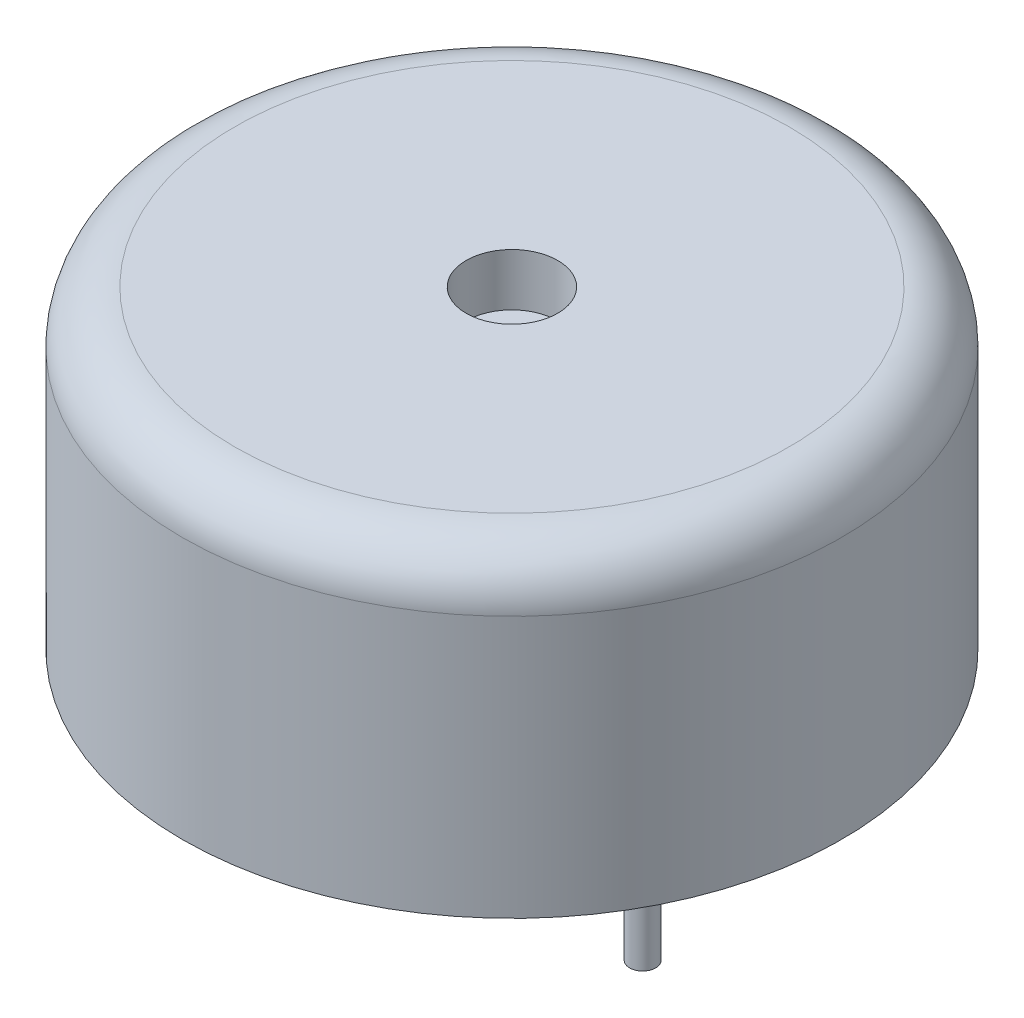
ISO-10303-21;
HEADER;
FILE_DESCRIPTION(('STEP AP214'),'2;1');
FILE_NAME('part.step','',(''),(''),'','','');
FILE_SCHEMA(('AUTOMOTIVE_DESIGN { 1 0 10303 214 1 1 1 1 }'));
ENDSEC;
DATA;
#1=APPLICATION_CONTEXT('core data for automotive mechanical design processes');
#2=APPLICATION_PROTOCOL_DEFINITION('international standard','automotive_design',2000,#1);
#3=PRODUCT_CONTEXT('',#1,'mechanical');
#4=PRODUCT('Part','Part','',(#3));
#5=PRODUCT_RELATED_PRODUCT_CATEGORY('part','',(#4));
#6=PRODUCT_DEFINITION_FORMATION('','',#4);
#7=PRODUCT_DEFINITION_CONTEXT('part definition',#1,'design');
#8=PRODUCT_DEFINITION('design','',#6,#7);
#9=PRODUCT_DEFINITION_SHAPE('','',#8);
#10=(LENGTH_UNIT() NAMED_UNIT(*) SI_UNIT(.MILLI.,.METRE.));
#11=(NAMED_UNIT(*) PLANE_ANGLE_UNIT() SI_UNIT($,.RADIAN.));
#12=(NAMED_UNIT(*) SI_UNIT($,.STERADIAN.) SOLID_ANGLE_UNIT());
#13=UNCERTAINTY_MEASURE_WITH_UNIT(LENGTH_MEASURE(1.E-05),#10,'distance_accuracy_value','');
#14=(GEOMETRIC_REPRESENTATION_CONTEXT(3) GLOBAL_UNCERTAINTY_ASSIGNED_CONTEXT((#13)) GLOBAL_UNIT_ASSIGNED_CONTEXT((#10,
#11,#12)) REPRESENTATION_CONTEXT('',''));
#15=CARTESIAN_POINT('',(0.,0.,0.));
#16=DIRECTION('',(0.,0.,1.));
#17=DIRECTION('',(1.,0.,0.));
#18=AXIS2_PLACEMENT_3D('',#15,#16,#17);
#19=CARTESIAN_POINT('',(0.,6.,0.));
#20=DIRECTION('',(0.,-1.,0.));
#21=DIRECTION('',(0.,0.,-1.));
#22=AXIS2_PLACEMENT_3D('',#19,#20,#21);
#23=CYLINDRICAL_SURFACE('',#22,6.3);
#24=CARTESIAN_POINT('',(0.,5.,0.));
#25=DIRECTION('',(0.,1.,0.));
#26=DIRECTION('',(0.,0.,1.));
#27=AXIS2_PLACEMENT_3D('',#24,#25,#26);
#28=CIRCLE('',#27,6.3);
#29=CARTESIAN_POINT('',(0.,5.,6.3));
#30=VERTEX_POINT('',#29);
#31=EDGE_CURVE('E76',#30,#30,#28,.F.);
#32=ORIENTED_EDGE('',*,*,#31,.T.);
#33=EDGE_LOOP('',(#32));
#34=FACE_BOUND('',#33,.T.);
#35=CARTESIAN_POINT('',(0.,0.,0.));
#36=DIRECTION('',(0.,1.,0.));
#37=DIRECTION('',(0.,0.,1.));
#38=AXIS2_PLACEMENT_3D('',#35,#36,#37);
#39=CIRCLE('',#38,6.3);
#40=CARTESIAN_POINT('',(0.,0.,6.3));
#41=VERTEX_POINT('',#40);
#42=EDGE_CURVE('E83',#41,#41,#39,.T.);
#43=ORIENTED_EDGE('',*,*,#42,.T.);
#44=EDGE_LOOP('',(#43));
#45=FACE_BOUND('',#44,.T.);
#46=ADVANCED_FACE('F41',(#34,#45),#23,.T.);
#47=CARTESIAN_POINT('',(0.,6.,0.));
#48=DIRECTION('',(0.,1.,0.));
#49=DIRECTION('',(0.,0.,1.));
#50=AXIS2_PLACEMENT_3D('',#47,#48,#49);
#51=PLANE('',#50);
#52=CARTESIAN_POINT('',(0.,6.,0.));
#53=DIRECTION('',(0.,1.,0.));
#54=DIRECTION('',(0.,0.,1.));
#55=AXIS2_PLACEMENT_3D('',#52,#53,#54);
#56=CIRCLE('',#55,0.875244423296637);
#57=CARTESIAN_POINT('',(0.,6.,0.875244423296637));
#58=VERTEX_POINT('',#57);
#59=EDGE_CURVE('E88',#58,#58,#56,.T.);
#60=ORIENTED_EDGE('',*,*,#59,.F.);
#61=EDGE_LOOP('',(#60));
#62=FACE_BOUND('',#61,.T.);
#63=CARTESIAN_POINT('',(0.,6.,0.));
#64=DIRECTION('',(0.,1.,0.));
#65=DIRECTION('',(0.,0.,1.));
#66=AXIS2_PLACEMENT_3D('',#63,#64,#65);
#67=CIRCLE('',#66,5.3);
#68=CARTESIAN_POINT('',(0.,6.,5.3));
#69=VERTEX_POINT('',#68);
#70=EDGE_CURVE('E79',#69,#69,#67,.T.);
#71=ORIENTED_EDGE('',*,*,#70,.T.);
#72=EDGE_LOOP('',(#71));
#73=FACE_BOUND('',#72,.T.);
#74=ADVANCED_FACE('F138',(#62,#73),#51,.T.);
#75=CARTESIAN_POINT('',(0.,0.,0.));
#76=DIRECTION('',(0.,1.,0.));
#77=DIRECTION('',(0.,0.,1.));
#78=AXIS2_PLACEMENT_3D('',#75,#76,#77);
#79=PLANE('',#78);
#80=CARTESIAN_POINT('',(0.,0.,-3.75));
#81=DIRECTION('',(0.,1.,0.));
#82=DIRECTION('',(0.,0.,1.));
#83=AXIS2_PLACEMENT_3D('',#80,#81,#82);
#84=CIRCLE('',#83,0.5);
#85=CARTESIAN_POINT('',(0.,0.,-3.25));
#86=VERTEX_POINT('',#85);
#87=EDGE_CURVE('E103',#86,#86,#84,.T.);
#88=ORIENTED_EDGE('',*,*,#87,.T.);
#89=EDGE_LOOP('',(#88));
#90=FACE_BOUND('',#89,.T.);
#91=CARTESIAN_POINT('',(-2.5,0.,0.));
#92=DIRECTION('',(0.,1.,0.));
#93=DIRECTION('',(0.,0.,1.));
#94=AXIS2_PLACEMENT_3D('',#91,#92,#93);
#95=CIRCLE('',#94,1.25);
#96=CARTESIAN_POINT('',(-2.5,0.,1.25));
#97=VERTEX_POINT('',#96);
#98=EDGE_CURVE('E69',#97,#97,#95,.F.);
#99=ORIENTED_EDGE('',*,*,#98,.F.);
#100=EDGE_LOOP('',(#99));
#101=FACE_BOUND('',#100,.T.);
#102=CARTESIAN_POINT('',(2.5,0.,0.));
#103=DIRECTION('',(0.,1.,0.));
#104=DIRECTION('',(0.,0.,1.));
#105=AXIS2_PLACEMENT_3D('',#102,#103,#104);
#106=CIRCLE('',#105,1.25);
#107=CARTESIAN_POINT('',(2.5,0.,1.25));
#108=VERTEX_POINT('',#107);
#109=EDGE_CURVE('E98',#108,#108,#106,.T.);
#110=ORIENTED_EDGE('',*,*,#109,.T.);
#111=EDGE_LOOP('',(#110));
#112=FACE_BOUND('',#111,.T.);
#113=CARTESIAN_POINT('',(0.,0.,3.75));
#114=DIRECTION('',(0.,1.,0.));
#115=DIRECTION('',(0.,0.,1.));
#116=AXIS2_PLACEMENT_3D('',#113,#114,#115);
#117=CIRCLE('',#116,0.5);
#118=CARTESIAN_POINT('',(0.,0.,4.25));
#119=VERTEX_POINT('',#118);
#120=EDGE_CURVE('E73',#119,#119,#117,.F.);
#121=ORIENTED_EDGE('',*,*,#120,.F.);
#122=EDGE_LOOP('',(#121));
#123=FACE_BOUND('',#122,.T.);
#124=ORIENTED_EDGE('',*,*,#42,.F.);
#125=EDGE_LOOP('',(#124));
#126=FACE_BOUND('',#125,.T.);
#127=ADVANCED_FACE('F144',(#90,#101,#112,#123,#126),#79,.F.);
#128=CARTESIAN_POINT('',(0.,5.,0.));
#129=DIRECTION('',(0.,1.,0.));
#130=DIRECTION('',(0.,0.,1.));
#131=AXIS2_PLACEMENT_3D('',#128,#129,#130);
#132=TOROIDAL_SURFACE('',#131,5.3,1.);
#133=ORIENTED_EDGE('',*,*,#31,.F.);
#134=EDGE_LOOP('',(#133));
#135=FACE_BOUND('',#134,.T.);
#136=ORIENTED_EDGE('',*,*,#70,.F.);
#137=EDGE_LOOP('',(#136));
#138=FACE_BOUND('',#137,.T.);
#139=ADVANCED_FACE('F150',(#135,#138),#132,.T.);
#140=CARTESIAN_POINT('',(0.,5.,0.));
#141=DIRECTION('',(0.,1.,0.));
#142=DIRECTION('',(0.,0.,1.));
#143=AXIS2_PLACEMENT_3D('',#140,#141,#142);
#144=CYLINDRICAL_SURFACE('',#143,0.875244423296637);
#145=CARTESIAN_POINT('',(0.,5.,0.));
#146=DIRECTION('',(0.,1.,0.));
#147=DIRECTION('',(0.,0.,1.));
#148=AXIS2_PLACEMENT_3D('',#145,#146,#147);
#149=CIRCLE('',#148,0.875244423296637);
#150=CARTESIAN_POINT('',(0.,5.,0.875244423296637));
#151=VERTEX_POINT('',#150);
#152=EDGE_CURVE('E87',#151,#151,#149,.T.);
#153=ORIENTED_EDGE('',*,*,#152,.F.);
#154=EDGE_LOOP('',(#153));
#155=FACE_BOUND('',#154,.T.);
#156=ORIENTED_EDGE('',*,*,#59,.T.);
#157=EDGE_LOOP('',(#156));
#158=FACE_BOUND('',#157,.T.);
#159=ADVANCED_FACE('F152',(#155,#158),#144,.F.);
#160=CARTESIAN_POINT('',(0.,5.,0.));
#161=DIRECTION('',(0.,1.,0.));
#162=DIRECTION('',(0.,0.,1.));
#163=AXIS2_PLACEMENT_3D('',#160,#161,#162);
#164=PLANE('',#163);
#165=ORIENTED_EDGE('',*,*,#152,.T.);
#166=EDGE_LOOP('',(#165));
#167=FACE_BOUND('',#166,.T.);
#168=ADVANCED_FACE('F188',(#167),#164,.T.);
#169=CARTESIAN_POINT('',(0.,-0.9,3.75));
#170=DIRECTION('',(0.,1.,0.));
#171=DIRECTION('',(0.,0.,1.));
#172=AXIS2_PLACEMENT_3D('',#169,#170,#171);
#173=CYLINDRICAL_SURFACE('',#172,0.5);
#174=CARTESIAN_POINT('',(0.,-0.9,3.75));
#175=DIRECTION('',(0.,1.,0.));
#176=DIRECTION('',(0.,0.,1.));
#177=AXIS2_PLACEMENT_3D('',#174,#175,#176);
#178=CIRCLE('',#177,0.5);
#179=CARTESIAN_POINT('',(0.,-0.9,4.25));
#180=VERTEX_POINT('',#179);
#181=EDGE_CURVE('E91',#180,#180,#178,.F.);
#182=ORIENTED_EDGE('',*,*,#181,.F.);
#183=EDGE_LOOP('',(#182));
#184=FACE_BOUND('',#183,.T.);
#185=ORIENTED_EDGE('',*,*,#120,.T.);
#186=EDGE_LOOP('',(#185));
#187=FACE_BOUND('',#186,.T.);
#188=ADVANCED_FACE('F186',(#184,#187),#173,.T.);
#189=CARTESIAN_POINT('',(0.,-0.9,0.));
#190=DIRECTION('',(0.,1.,0.));
#191=DIRECTION('',(0.,0.,1.));
#192=AXIS2_PLACEMENT_3D('',#189,#190,#191);
#193=PLANE('',#192);
#194=ORIENTED_EDGE('',*,*,#181,.T.);
#195=EDGE_LOOP('',(#194));
#196=FACE_BOUND('',#195,.T.);
#197=ADVANCED_FACE('F175',(#196),#193,.F.);
#198=CARTESIAN_POINT('',(2.5,-0.9,0.));
#199=DIRECTION('',(0.,1.,0.));
#200=DIRECTION('',(0.,0.,1.));
#201=AXIS2_PLACEMENT_3D('',#198,#199,#200);
#202=CYLINDRICAL_SURFACE('',#201,1.25);
#203=CARTESIAN_POINT('',(2.5,-0.7,0.));
#204=DIRECTION('',(0.,1.,0.));
#205=DIRECTION('',(0.,0.,1.));
#206=AXIS2_PLACEMENT_3D('',#203,#204,#205);
#207=CIRCLE('',#206,1.25);
#208=CARTESIAN_POINT('',(2.5,-0.7,1.25));
#209=VERTEX_POINT('',#208);
#210=EDGE_CURVE('E63',#209,#209,#207,.T.);
#211=ORIENTED_EDGE('',*,*,#210,.T.);
#212=EDGE_LOOP('',(#211));
#213=FACE_BOUND('',#212,.T.);
#214=ORIENTED_EDGE('',*,*,#109,.F.);
#215=EDGE_LOOP('',(#214));
#216=FACE_BOUND('',#215,.T.);
#217=ADVANCED_FACE('F171',(#213,#216),#202,.T.);
#218=CARTESIAN_POINT('',(0.,-0.9,0.));
#219=DIRECTION('',(0.,1.,0.));
#220=DIRECTION('',(0.,0.,1.));
#221=AXIS2_PLACEMENT_3D('',#218,#219,#220);
#222=PLANE('',#221);
#223=CARTESIAN_POINT('',(2.5,-0.9,0.));
#224=DIRECTION('',(0.,1.,0.));
#225=DIRECTION('',(0.,0.,1.));
#226=AXIS2_PLACEMENT_3D('',#223,#224,#225);
#227=CIRCLE('',#226,0.25);
#228=CARTESIAN_POINT('',(2.5,-0.9,0.25));
#229=VERTEX_POINT('',#228);
#230=EDGE_CURVE('E118',#229,#229,#227,.T.);
#231=ORIENTED_EDGE('',*,*,#230,.T.);
#232=EDGE_LOOP('',(#231));
#233=FACE_BOUND('',#232,.T.);
#234=CARTESIAN_POINT('',(2.5,-0.9,0.));
#235=DIRECTION('',(0.,1.,0.));
#236=DIRECTION('',(0.,0.,1.));
#237=AXIS2_PLACEMENT_3D('',#234,#235,#236);
#238=CIRCLE('',#237,1.05);
#239=CARTESIAN_POINT('',(2.5,-0.9,1.05));
#240=VERTEX_POINT('',#239);
#241=EDGE_CURVE('E56',#240,#240,#238,.F.);
#242=ORIENTED_EDGE('',*,*,#241,.T.);
#243=EDGE_LOOP('',(#242));
#244=FACE_BOUND('',#243,.T.);
#245=ADVANCED_FACE('F174',(#233,#244),#222,.F.);
#246=CARTESIAN_POINT('',(-2.5,-0.9,0.));
#247=DIRECTION('',(0.,1.,0.));
#248=DIRECTION('',(0.,0.,1.));
#249=AXIS2_PLACEMENT_3D('',#246,#247,#248);
#250=CYLINDRICAL_SURFACE('',#249,1.25);
#251=CARTESIAN_POINT('',(-2.5,-0.7,0.));
#252=DIRECTION('',(0.,1.,0.));
#253=DIRECTION('',(0.,0.,1.));
#254=AXIS2_PLACEMENT_3D('',#251,#252,#253);
#255=CIRCLE('',#254,1.25);
#256=CARTESIAN_POINT('',(-2.5,-0.7,1.25));
#257=VERTEX_POINT('',#256);
#258=EDGE_CURVE('E10',#257,#257,#255,.T.);
#259=ORIENTED_EDGE('',*,*,#258,.T.);
#260=EDGE_LOOP('',(#259));
#261=FACE_BOUND('',#260,.T.);
#262=ORIENTED_EDGE('',*,*,#98,.T.);
#263=EDGE_LOOP('',(#262));
#264=FACE_BOUND('',#263,.T.);
#265=ADVANCED_FACE('F240',(#261,#264),#250,.T.);
#266=CARTESIAN_POINT('',(0.,-0.9,0.));
#267=DIRECTION('',(0.,1.,0.));
#268=DIRECTION('',(0.,0.,1.));
#269=AXIS2_PLACEMENT_3D('',#266,#267,#268);
#270=PLANE('',#269);
#271=CARTESIAN_POINT('',(-2.5,-0.9,0.));
#272=DIRECTION('',(0.,1.,0.));
#273=DIRECTION('',(0.,0.,1.));
#274=AXIS2_PLACEMENT_3D('',#271,#272,#273);
#275=CIRCLE('',#274,0.25);
#276=CARTESIAN_POINT('',(-2.5,-0.9,0.25));
#277=VERTEX_POINT('',#276);
#278=EDGE_CURVE('E111',#277,#277,#275,.T.);
#279=ORIENTED_EDGE('',*,*,#278,.T.);
#280=EDGE_LOOP('',(#279));
#281=FACE_BOUND('',#280,.T.);
#282=CARTESIAN_POINT('',(-2.5,-0.9,0.));
#283=DIRECTION('',(0.,1.,0.));
#284=DIRECTION('',(0.,0.,1.));
#285=AXIS2_PLACEMENT_3D('',#282,#283,#284);
#286=CIRCLE('',#285,1.05);
#287=CARTESIAN_POINT('',(-2.5,-0.9,1.05));
#288=VERTEX_POINT('',#287);
#289=EDGE_CURVE('E49',#288,#288,#286,.F.);
#290=ORIENTED_EDGE('',*,*,#289,.T.);
#291=EDGE_LOOP('',(#290));
#292=FACE_BOUND('',#291,.T.);
#293=ADVANCED_FACE('F250',(#281,#292),#270,.F.);
#294=CARTESIAN_POINT('',(0.,-0.9,-3.75));
#295=DIRECTION('',(0.,1.,0.));
#296=DIRECTION('',(0.,0.,1.));
#297=AXIS2_PLACEMENT_3D('',#294,#295,#296);
#298=CYLINDRICAL_SURFACE('',#297,0.5);
#299=CARTESIAN_POINT('',(0.,-0.9,-3.75));
#300=DIRECTION('',(0.,1.,0.));
#301=DIRECTION('',(0.,0.,1.));
#302=AXIS2_PLACEMENT_3D('',#299,#300,#301);
#303=CIRCLE('',#302,0.5);
#304=CARTESIAN_POINT('',(0.,-0.9,-3.25));
#305=VERTEX_POINT('',#304);
#306=EDGE_CURVE('E102',#305,#305,#303,.T.);
#307=ORIENTED_EDGE('',*,*,#306,.T.);
#308=EDGE_LOOP('',(#307));
#309=FACE_BOUND('',#308,.T.);
#310=ORIENTED_EDGE('',*,*,#87,.F.);
#311=EDGE_LOOP('',(#310));
#312=FACE_BOUND('',#311,.T.);
#313=ADVANCED_FACE('F164',(#309,#312),#298,.T.);
#314=CARTESIAN_POINT('',(0.,-0.9,0.));
#315=DIRECTION('',(0.,1.,0.));
#316=DIRECTION('',(0.,0.,1.));
#317=AXIS2_PLACEMENT_3D('',#314,#315,#316);
#318=PLANE('',#317);
#319=ORIENTED_EDGE('',*,*,#306,.F.);
#320=EDGE_LOOP('',(#319));
#321=FACE_BOUND('',#320,.T.);
#322=ADVANCED_FACE('F156',(#321),#318,.F.);
#323=CARTESIAN_POINT('',(2.5,-0.7,0.));
#324=DIRECTION('',(0.,1.,0.));
#325=DIRECTION('',(0.,0.,1.));
#326=AXIS2_PLACEMENT_3D('',#323,#324,#325);
#327=TOROIDAL_SURFACE('',#326,1.05,0.2);
#328=ORIENTED_EDGE('',*,*,#241,.F.);
#329=EDGE_LOOP('',(#328));
#330=FACE_BOUND('',#329,.T.);
#331=ORIENTED_EDGE('',*,*,#210,.F.);
#332=EDGE_LOOP('',(#331));
#333=FACE_BOUND('',#332,.T.);
#334=ADVANCED_FACE('F154',(#330,#333),#327,.T.);
#335=CARTESIAN_POINT('',(-2.5,-0.7,0.));
#336=DIRECTION('',(0.,1.,0.));
#337=DIRECTION('',(0.,0.,1.));
#338=AXIS2_PLACEMENT_3D('',#335,#336,#337);
#339=TOROIDAL_SURFACE('',#338,1.05,0.2);
#340=ORIENTED_EDGE('',*,*,#258,.F.);
#341=EDGE_LOOP('',(#340));
#342=FACE_BOUND('',#341,.T.);
#343=ORIENTED_EDGE('',*,*,#289,.F.);
#344=EDGE_LOOP('',(#343));
#345=FACE_BOUND('',#344,.T.);
#346=ADVANCED_FACE('F43',(#342,#345),#339,.T.);
#347=CARTESIAN_POINT('',(-2.5,-3.9,0.));
#348=DIRECTION('',(0.,1.,0.));
#349=DIRECTION('',(0.,0.,1.));
#350=AXIS2_PLACEMENT_3D('',#347,#348,#349);
#351=CYLINDRICAL_SURFACE('',#350,0.25);
#352=CARTESIAN_POINT('',(-2.5,-3.9,0.));
#353=DIRECTION('',(0.,1.,0.));
#354=DIRECTION('',(0.,0.,1.));
#355=AXIS2_PLACEMENT_3D('',#352,#353,#354);
#356=CIRCLE('',#355,0.25);
#357=CARTESIAN_POINT('',(-2.5,-3.9,0.25));
#358=VERTEX_POINT('',#357);
#359=EDGE_CURVE('E107',#358,#358,#356,.T.);
#360=ORIENTED_EDGE('',*,*,#359,.T.);
#361=EDGE_LOOP('',(#360));
#362=FACE_BOUND('',#361,.T.);
#363=ORIENTED_EDGE('',*,*,#278,.F.);
#364=EDGE_LOOP('',(#363));
#365=FACE_BOUND('',#364,.T.);
#366=ADVANCED_FACE('F162',(#362,#365),#351,.T.);
#367=CARTESIAN_POINT('',(-2.5,-3.9,0.));
#368=DIRECTION('',(0.,1.,0.));
#369=DIRECTION('',(0.,0.,1.));
#370=AXIS2_PLACEMENT_3D('',#367,#368,#369);
#371=PLANE('',#370);
#372=ORIENTED_EDGE('',*,*,#359,.F.);
#373=EDGE_LOOP('',(#372));
#374=FACE_BOUND('',#373,.T.);
#375=ADVANCED_FACE('F135',(#374),#371,.F.);
#376=CARTESIAN_POINT('',(2.5,-3.9,0.));
#377=DIRECTION('',(0.,1.,0.));
#378=DIRECTION('',(0.,0.,1.));
#379=AXIS2_PLACEMENT_3D('',#376,#377,#378);
#380=CYLINDRICAL_SURFACE('',#379,0.25);
#381=CARTESIAN_POINT('',(2.5,-3.9,0.));
#382=DIRECTION('',(0.,1.,0.));
#383=DIRECTION('',(0.,0.,1.));
#384=AXIS2_PLACEMENT_3D('',#381,#382,#383);
#385=CIRCLE('',#384,0.25);
#386=CARTESIAN_POINT('',(2.5,-3.9,0.25));
#387=VERTEX_POINT('',#386);
#388=EDGE_CURVE('E114',#387,#387,#385,.T.);
#389=ORIENTED_EDGE('',*,*,#388,.T.);
#390=EDGE_LOOP('',(#389));
#391=FACE_BOUND('',#390,.T.);
#392=ORIENTED_EDGE('',*,*,#230,.F.);
#393=EDGE_LOOP('',(#392));
#394=FACE_BOUND('',#393,.T.);
#395=ADVANCED_FACE('F126',(#391,#394),#380,.T.);
#396=CARTESIAN_POINT('',(2.5,-3.9,0.));
#397=DIRECTION('',(0.,1.,0.));
#398=DIRECTION('',(0.,0.,1.));
#399=AXIS2_PLACEMENT_3D('',#396,#397,#398);
#400=PLANE('',#399);
#401=ORIENTED_EDGE('',*,*,#388,.F.);
#402=EDGE_LOOP('',(#401));
#403=FACE_BOUND('',#402,.T.);
#404=ADVANCED_FACE('F129',(#403),#400,.F.);
#405=CLOSED_SHELL('',(#46,#74,#127,#139,#159,#168,#188,#197,#217,#245,#265,#293,#313,#322,#334,
#346,#366,#375,#395,#404));
#406=MANIFOLD_SOLID_BREP('B2',#405);
#407=ADVANCED_BREP_SHAPE_REPRESENTATION('',(#18,#406),#14);
#408=SHAPE_DEFINITION_REPRESENTATION(#9,#407);
ENDSEC;
END-ISO-10303-21;
